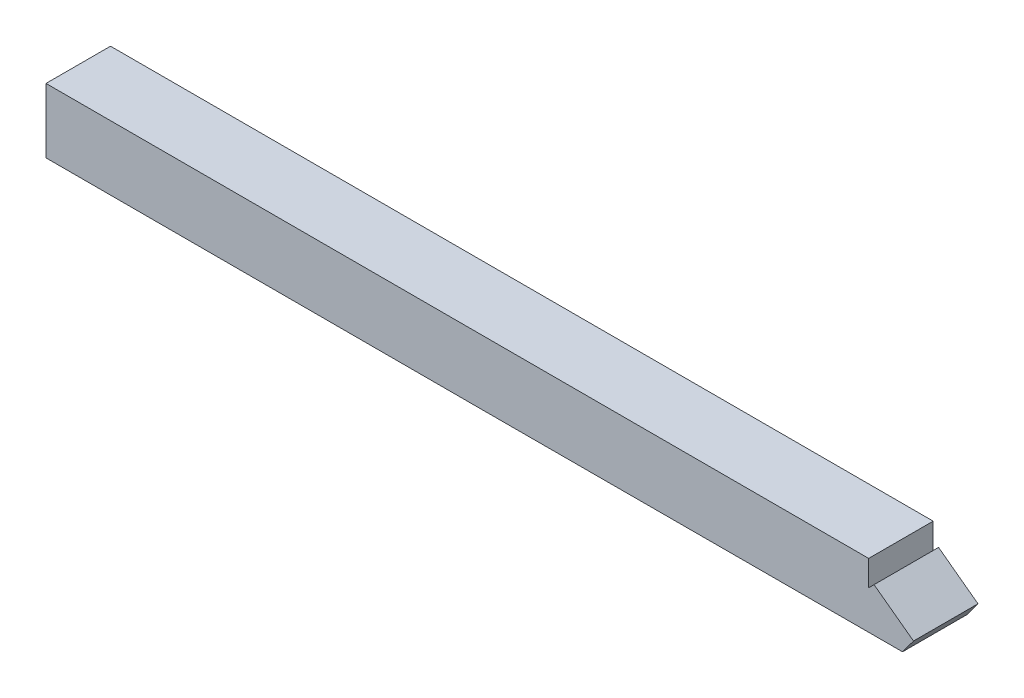
ISO-10303-21;
HEADER;
FILE_DESCRIPTION(('STEP AP214'),'2;1');
FILE_NAME('part.step','',(''),(''),'','','');
FILE_SCHEMA(('AUTOMOTIVE_DESIGN { 1 0 10303 214 1 1 1 1 }'));
ENDSEC;
DATA;
#1=APPLICATION_CONTEXT('core data for automotive mechanical design processes');
#2=APPLICATION_PROTOCOL_DEFINITION('international standard','automotive_design',2000,#1);
#3=PRODUCT_CONTEXT('',#1,'mechanical');
#4=PRODUCT('Part','Part','',(#3));
#5=PRODUCT_RELATED_PRODUCT_CATEGORY('part','',(#4));
#6=PRODUCT_DEFINITION_FORMATION('','',#4);
#7=PRODUCT_DEFINITION_CONTEXT('part definition',#1,'design');
#8=PRODUCT_DEFINITION('design','',#6,#7);
#9=PRODUCT_DEFINITION_SHAPE('','',#8);
#10=(LENGTH_UNIT() NAMED_UNIT(*) SI_UNIT(.MILLI.,.METRE.));
#11=(NAMED_UNIT(*) PLANE_ANGLE_UNIT() SI_UNIT($,.RADIAN.));
#12=(NAMED_UNIT(*) SI_UNIT($,.STERADIAN.) SOLID_ANGLE_UNIT());
#13=UNCERTAINTY_MEASURE_WITH_UNIT(LENGTH_MEASURE(1.E-05),#10,'distance_accuracy_value','');
#14=(GEOMETRIC_REPRESENTATION_CONTEXT(3) GLOBAL_UNCERTAINTY_ASSIGNED_CONTEXT((#13)) GLOBAL_UNIT_ASSIGNED_CONTEXT((#10,
#11,#12)) REPRESENTATION_CONTEXT('',''));
#15=CARTESIAN_POINT('',(0.,0.,0.));
#16=DIRECTION('',(0.,0.,1.));
#17=DIRECTION('',(1.,0.,0.));
#18=AXIS2_PLACEMENT_3D('',#15,#16,#17);
#19=CARTESIAN_POINT('',(16.2,0.0200073798584463,2.5));
#20=DIRECTION('',(-0.00123502250617323,0.999999237359414,0.));
#21=DIRECTION('',(-0.999999237359414,-0.00123502250617323,0.));
#22=AXIS2_PLACEMENT_3D('',#19,#20,#21);
#23=PLANE('',#22);
#24=DIRECTION('',(0.999999237359414,0.00123502250617323,0.));
#25=VECTOR('',#24,1.);
#26=CARTESIAN_POINT('',(16.2,0.0200073798584463,0.));
#27=LINE('',#26,#25);
#28=CARTESIAN_POINT('',(0.,0.,0.));
#29=VERTEX_POINT('',#28);
#30=CARTESIAN_POINT('',(16.2,0.0200073798584463,0.));
#31=VERTEX_POINT('',#30);
#32=EDGE_CURVE('E124',#29,#31,#27,.T.);
#33=ORIENTED_EDGE('',*,*,#32,.T.);
#34=DIRECTION('',(0.,0.,-1.));
#35=VECTOR('',#34,1.);
#36=CARTESIAN_POINT('',(16.2,0.0200073798584463,2.5));
#37=LINE('',#36,#35);
#38=CARTESIAN_POINT('',(16.2,0.0200073798584463,2.5));
#39=VERTEX_POINT('',#38);
#40=EDGE_CURVE('E11',#39,#31,#37,.T.);
#41=ORIENTED_EDGE('',*,*,#40,.F.);
#42=DIRECTION('',(0.999999237359414,0.00123502250617323,0.));
#43=VECTOR('',#42,1.);
#44=CARTESIAN_POINT('',(16.2,0.0200073798584463,2.5));
#45=LINE('',#44,#43);
#46=CARTESIAN_POINT('',(0.,0.,2.5));
#47=VERTEX_POINT('',#46);
#48=EDGE_CURVE('E51',#47,#39,#45,.T.);
#49=ORIENTED_EDGE('',*,*,#48,.F.);
#50=DIRECTION('',(0.,0.,-1.));
#51=VECTOR('',#50,1.);
#52=CARTESIAN_POINT('',(0.,0.,2.5));
#53=LINE('',#52,#51);
#54=EDGE_CURVE('E80',#47,#29,#53,.T.);
#55=ORIENTED_EDGE('',*,*,#54,.T.);
#56=EDGE_LOOP('',(#33,#41,#49,#55));
#57=FACE_BOUND('',#56,.T.);
#58=ADVANCED_FACE('F34',(#57),#23,.F.);
#59=CARTESIAN_POINT('',(16.6242935772563,0.594484954615779,2.5));
#60=DIRECTION('',(-0.804390452394621,0.594101001595163,0.));
#61=DIRECTION('',(-0.594101001595163,-0.804390452394622,0.));
#62=AXIS2_PLACEMENT_3D('',#59,#60,#61);
#63=PLANE('',#62);
#64=DIRECTION('',(0.594101001595163,0.804390452394621,0.));
#65=VECTOR('',#64,1.);
#66=CARTESIAN_POINT('',(16.6242935772563,0.594484954615779,0.));
#67=LINE('',#66,#65);
#68=CARTESIAN_POINT('',(16.6242935772563,0.594484954615779,0.));
#69=VERTEX_POINT('',#68);
#70=EDGE_CURVE('E126',#31,#69,#67,.T.);
#71=ORIENTED_EDGE('',*,*,#70,.T.);
#72=DIRECTION('',(0.,0.,-1.));
#73=VECTOR('',#72,1.);
#74=CARTESIAN_POINT('',(16.6242935772563,0.594484954615779,2.5));
#75=LINE('',#74,#73);
#76=CARTESIAN_POINT('',(16.6242935772563,0.594484954615779,2.5));
#77=VERTEX_POINT('',#76);
#78=EDGE_CURVE('E43',#77,#69,#75,.T.);
#79=ORIENTED_EDGE('',*,*,#78,.F.);
#80=DIRECTION('',(0.594101001595163,0.804390452394621,0.));
#81=VECTOR('',#80,1.);
#82=CARTESIAN_POINT('',(16.6242935772563,0.594484954615779,2.5));
#83=LINE('',#82,#81);
#84=EDGE_CURVE('E88',#39,#77,#83,.T.);
#85=ORIENTED_EDGE('',*,*,#84,.F.);
#86=ORIENTED_EDGE('',*,*,#40,.T.);
#87=EDGE_LOOP('',(#71,#79,#85,#86));
#88=FACE_BOUND('',#87,.T.);
#89=ADVANCED_FACE('F184',(#88),#63,.F.);
#90=CARTESIAN_POINT('',(15.0959830313986,1.72325373020171,2.5));
#91=DIRECTION('',(-0.594101001595164,-0.804390452394621,0.));
#92=DIRECTION('',(0.804390452394621,-0.594101001595164,0.));
#93=AXIS2_PLACEMENT_3D('',#90,#91,#92);
#94=PLANE('',#93);
#95=DIRECTION('',(-0.804390452394621,0.594101001595164,0.));
#96=VECTOR('',#95,1.);
#97=CARTESIAN_POINT('',(15.0959830313986,1.72325373020171,0.));
#98=LINE('',#97,#96);
#99=CARTESIAN_POINT('',(15.0959830313986,1.72325373020171,0.));
#100=VERTEX_POINT('',#99);
#101=EDGE_CURVE('E129',#69,#100,#98,.T.);
#102=ORIENTED_EDGE('',*,*,#101,.T.);
#103=DIRECTION('',(0.,0.,-1.));
#104=VECTOR('',#103,1.);
#105=CARTESIAN_POINT('',(15.0959830313986,1.72325373020171,2.5));
#106=LINE('',#105,#104);
#107=CARTESIAN_POINT('',(15.0959830313986,1.72325373020171,2.5));
#108=VERTEX_POINT('',#107);
#109=EDGE_CURVE('E114',#108,#100,#106,.T.);
#110=ORIENTED_EDGE('',*,*,#109,.F.);
#111=DIRECTION('',(-0.804390452394621,0.594101001595164,0.));
#112=VECTOR('',#111,1.);
#113=CARTESIAN_POINT('',(15.0959830313986,1.72325373020171,2.5));
#114=LINE('',#113,#112);
#115=EDGE_CURVE('E105',#77,#108,#114,.T.);
#116=ORIENTED_EDGE('',*,*,#115,.F.);
#117=ORIENTED_EDGE('',*,*,#78,.T.);
#118=EDGE_LOOP('',(#102,#110,#116,#117));
#119=FACE_BOUND('',#118,.T.);
#120=ADVANCED_FACE('F141',(#119),#94,.F.);
#121=CARTESIAN_POINT('',(14.8868454936691,1.51411619247225,2.5));
#122=DIRECTION('',(0.707106781186548,-0.707106781186548,0.));
#123=DIRECTION('',(0.707106781186548,0.707106781186548,0.));
#124=AXIS2_PLACEMENT_3D('',#121,#122,#123);
#125=PLANE('',#124);
#126=DIRECTION('',(-0.707106781186547,-0.707106781186547,0.));
#127=VECTOR('',#126,1.);
#128=CARTESIAN_POINT('',(14.8868454936691,1.51411619247225,0.));
#129=LINE('',#128,#127);
#130=CARTESIAN_POINT('',(14.8868454936691,1.51411619247225,0.));
#131=VERTEX_POINT('',#130);
#132=EDGE_CURVE('E113',#100,#131,#129,.T.);
#133=ORIENTED_EDGE('',*,*,#132,.T.);
#134=DIRECTION('',(0.,0.,-1.));
#135=VECTOR('',#134,1.);
#136=CARTESIAN_POINT('',(14.8868454936691,1.51411619247225,2.5));
#137=LINE('',#136,#135);
#138=CARTESIAN_POINT('',(14.8868454936691,1.51411619247225,2.5));
#139=VERTEX_POINT('',#138);
#140=EDGE_CURVE('E110',#139,#131,#137,.T.);
#141=ORIENTED_EDGE('',*,*,#140,.F.);
#142=DIRECTION('',(-0.707106781186547,-0.707106781186547,0.));
#143=VECTOR('',#142,1.);
#144=CARTESIAN_POINT('',(14.8868454936691,1.51411619247225,2.5));
#145=LINE('',#144,#143);
#146=EDGE_CURVE('E98',#108,#139,#145,.T.);
#147=ORIENTED_EDGE('',*,*,#146,.F.);
#148=ORIENTED_EDGE('',*,*,#109,.T.);
#149=EDGE_LOOP('',(#133,#141,#147,#148));
#150=FACE_BOUND('',#149,.T.);
#151=ADVANCED_FACE('F111',(#150),#125,.F.);
#152=CARTESIAN_POINT('',(14.8868454936691,1.51411619247225,2.5));
#153=DIRECTION('',(-1.,0.,0.));
#154=DIRECTION('',(0.,-1.,0.));
#155=AXIS2_PLACEMENT_3D('',#152,#153,#154);
#156=PLANE('',#155);
#157=DIRECTION('',(0.,1.,0.));
#158=VECTOR('',#157,1.);
#159=CARTESIAN_POINT('',(14.8868454936691,1.51411619247225,0.));
#160=LINE('',#159,#158);
#161=CARTESIAN_POINT('',(14.8868454936691,2.5,0.));
#162=VERTEX_POINT('',#161);
#163=EDGE_CURVE('E76',#131,#162,#160,.T.);
#164=ORIENTED_EDGE('',*,*,#163,.T.);
#165=DIRECTION('',(0.,0.,-1.));
#166=VECTOR('',#165,1.);
#167=CARTESIAN_POINT('',(14.8868454936691,2.5,2.5));
#168=LINE('',#167,#166);
#169=CARTESIAN_POINT('',(14.8868454936691,2.5,2.5));
#170=VERTEX_POINT('',#169);
#171=EDGE_CURVE('E115',#170,#162,#168,.T.);
#172=ORIENTED_EDGE('',*,*,#171,.F.);
#173=DIRECTION('',(0.,1.,0.));
#174=VECTOR('',#173,1.);
#175=CARTESIAN_POINT('',(14.8868454936691,1.51411619247225,2.5));
#176=LINE('',#175,#174);
#177=EDGE_CURVE('E103',#139,#170,#176,.T.);
#178=ORIENTED_EDGE('',*,*,#177,.F.);
#179=ORIENTED_EDGE('',*,*,#140,.T.);
#180=EDGE_LOOP('',(#164,#172,#178,#179));
#181=FACE_BOUND('',#180,.T.);
#182=ADVANCED_FACE('F117',(#181),#156,.F.);
#183=CARTESIAN_POINT('',(14.8868454936691,2.5,2.5));
#184=DIRECTION('',(0.,-1.,0.));
#185=DIRECTION('',(1.,0.,0.));
#186=AXIS2_PLACEMENT_3D('',#183,#184,#185);
#187=PLANE('',#186);
#188=DIRECTION('',(-1.,0.,0.));
#189=VECTOR('',#188,1.);
#190=CARTESIAN_POINT('',(14.8868454936691,2.5,0.));
#191=LINE('',#190,#189);
#192=CARTESIAN_POINT('',(-17.,2.5,0.));
#193=VERTEX_POINT('',#192);
#194=EDGE_CURVE('E133',#162,#193,#191,.T.);
#195=ORIENTED_EDGE('',*,*,#194,.T.);
#196=DIRECTION('',(0.,0.,-1.));
#197=VECTOR('',#196,1.);
#198=CARTESIAN_POINT('',(-17.,2.5,2.5));
#199=LINE('',#198,#197);
#200=CARTESIAN_POINT('',(-17.,2.5,2.5));
#201=VERTEX_POINT('',#200);
#202=EDGE_CURVE('E154',#201,#193,#199,.T.);
#203=ORIENTED_EDGE('',*,*,#202,.F.);
#204=DIRECTION('',(-1.,0.,0.));
#205=VECTOR('',#204,1.);
#206=CARTESIAN_POINT('',(14.8868454936691,2.5,2.5));
#207=LINE('',#206,#205);
#208=EDGE_CURVE('E119',#170,#201,#207,.T.);
#209=ORIENTED_EDGE('',*,*,#208,.F.);
#210=ORIENTED_EDGE('',*,*,#171,.T.);
#211=EDGE_LOOP('',(#195,#203,#209,#210));
#212=FACE_BOUND('',#211,.T.);
#213=ADVANCED_FACE('F153',(#212),#187,.F.);
#214=CARTESIAN_POINT('',(0.,0.,2.5));
#215=DIRECTION('',(0.,0.,-1.));
#216=DIRECTION('',(-1.,0.,0.));
#217=AXIS2_PLACEMENT_3D('',#214,#215,#216);
#218=PLANE('',#217);
#219=ORIENTED_EDGE('',*,*,#48,.T.);
#220=ORIENTED_EDGE('',*,*,#84,.T.);
#221=ORIENTED_EDGE('',*,*,#115,.T.);
#222=ORIENTED_EDGE('',*,*,#146,.T.);
#223=ORIENTED_EDGE('',*,*,#177,.T.);
#224=ORIENTED_EDGE('',*,*,#208,.T.);
#225=DIRECTION('',(0.,1.,0.));
#226=VECTOR('',#225,1.);
#227=CARTESIAN_POINT('',(-17.,0.,2.5));
#228=LINE('',#227,#226);
#229=CARTESIAN_POINT('',(-17.,0.,2.5));
#230=VERTEX_POINT('',#229);
#231=EDGE_CURVE('E167',#230,#201,#228,.T.);
#232=ORIENTED_EDGE('',*,*,#231,.F.);
#233=DIRECTION('',(1.,0.,0.));
#234=VECTOR('',#233,1.);
#235=CARTESIAN_POINT('',(-17.,0.,2.5));
#236=LINE('',#235,#234);
#237=EDGE_CURVE('E169',#230,#47,#236,.T.);
#238=ORIENTED_EDGE('',*,*,#237,.T.);
#239=EDGE_LOOP('',(#219,#220,#221,#222,#223,#224,#232,#238));
#240=FACE_BOUND('',#239,.T.);
#241=ADVANCED_FACE('F100',(#240),#218,.F.);
#242=CARTESIAN_POINT('',(0.,0.,0.));
#243=DIRECTION('',(0.,0.,-1.));
#244=DIRECTION('',(-1.,0.,0.));
#245=AXIS2_PLACEMENT_3D('',#242,#243,#244);
#246=PLANE('',#245);
#247=ORIENTED_EDGE('',*,*,#32,.F.);
#248=DIRECTION('',(1.,0.,0.));
#249=VECTOR('',#248,1.);
#250=CARTESIAN_POINT('',(-17.,0.,0.));
#251=LINE('',#250,#249);
#252=CARTESIAN_POINT('',(-17.,0.,0.));
#253=VERTEX_POINT('',#252);
#254=EDGE_CURVE('E171',#253,#29,#251,.T.);
#255=ORIENTED_EDGE('',*,*,#254,.F.);
#256=DIRECTION('',(0.,-1.,0.));
#257=VECTOR('',#256,1.);
#258=CARTESIAN_POINT('',(-17.,2.5,0.));
#259=LINE('',#258,#257);
#260=EDGE_CURVE('E149',#193,#253,#259,.T.);
#261=ORIENTED_EDGE('',*,*,#260,.F.);
#262=ORIENTED_EDGE('',*,*,#194,.F.);
#263=ORIENTED_EDGE('',*,*,#163,.F.);
#264=ORIENTED_EDGE('',*,*,#132,.F.);
#265=ORIENTED_EDGE('',*,*,#101,.F.);
#266=ORIENTED_EDGE('',*,*,#70,.F.);
#267=EDGE_LOOP('',(#247,#255,#261,#262,#263,#264,#265,#266));
#268=FACE_BOUND('',#267,.T.);
#269=ADVANCED_FACE('F143',(#268),#246,.T.);
#270=CARTESIAN_POINT('',(-17.,0.,0.));
#271=DIRECTION('',(0.,1.,0.));
#272=DIRECTION('',(-1.,0.,0.));
#273=AXIS2_PLACEMENT_3D('',#270,#271,#272);
#274=PLANE('',#273);
#275=ORIENTED_EDGE('',*,*,#54,.F.);
#276=ORIENTED_EDGE('',*,*,#237,.F.);
#277=DIRECTION('',(0.,0.,1.));
#278=VECTOR('',#277,1.);
#279=CARTESIAN_POINT('',(-17.,0.,0.));
#280=LINE('',#279,#278);
#281=EDGE_CURVE('E163',#253,#230,#280,.T.);
#282=ORIENTED_EDGE('',*,*,#281,.F.);
#283=ORIENTED_EDGE('',*,*,#254,.T.);
#284=EDGE_LOOP('',(#275,#276,#282,#283));
#285=FACE_BOUND('',#284,.T.);
#286=ADVANCED_FACE('F200',(#285),#274,.F.);
#287=CARTESIAN_POINT('',(-17.,0.,0.));
#288=DIRECTION('',(-1.,0.,0.));
#289=DIRECTION('',(0.,-1.,0.));
#290=AXIS2_PLACEMENT_3D('',#287,#288,#289);
#291=PLANE('',#290);
#292=CARTESIAN_POINT('',(-17.,1.25,1.25));
#293=DIRECTION('',(-1.,0.,0.));
#294=DIRECTION('',(0.,-1.,0.));
#295=AXIS2_PLACEMENT_3D('',#292,#293,#294);
#296=CIRCLE('',#295,1.);
#297=CARTESIAN_POINT('',(-17.,0.250000000000003,1.25));
#298=VERTEX_POINT('',#297);
#299=EDGE_CURVE('E234',#298,#298,#296,.T.);
#300=ORIENTED_EDGE('',*,*,#299,.F.);
#301=EDGE_LOOP('',(#300));
#302=FACE_BOUND('',#301,.T.);
#303=ORIENTED_EDGE('',*,*,#202,.T.);
#304=ORIENTED_EDGE('',*,*,#260,.T.);
#305=ORIENTED_EDGE('',*,*,#281,.T.);
#306=ORIENTED_EDGE('',*,*,#231,.T.);
#307=EDGE_LOOP('',(#303,#304,#305,#306));
#308=FACE_BOUND('',#307,.T.);
#309=ADVANCED_FACE('F168',(#302,#308),#291,.T.);
#310=CARTESIAN_POINT('',(-7.5,1.25,1.25));
#311=DIRECTION('',(-1.,0.,0.));
#312=DIRECTION('',(0.,-1.,0.));
#313=AXIS2_PLACEMENT_3D('',#310,#311,#312);
#314=CYLINDRICAL_SURFACE('',#313,1.);
#315=CARTESIAN_POINT('',(-7.5,1.25,1.25));
#316=DIRECTION('',(-1.,0.,0.));
#317=DIRECTION('',(0.,-1.,0.));
#318=AXIS2_PLACEMENT_3D('',#315,#316,#317);
#319=CIRCLE('',#318,1.);
#320=CARTESIAN_POINT('',(-7.5,0.250000000000001,1.25));
#321=VERTEX_POINT('',#320);
#322=EDGE_CURVE('E233',#321,#321,#319,.T.);
#323=ORIENTED_EDGE('',*,*,#322,.F.);
#324=EDGE_LOOP('',(#323));
#325=FACE_BOUND('',#324,.T.);
#326=ORIENTED_EDGE('',*,*,#299,.T.);
#327=EDGE_LOOP('',(#326));
#328=FACE_BOUND('',#327,.T.);
#329=ADVANCED_FACE('F221',(#325,#328),#314,.F.);
#330=CARTESIAN_POINT('',(-7.5,1.25,1.25));
#331=DIRECTION('',(-1.,0.,0.));
#332=DIRECTION('',(0.,-1.,0.));
#333=AXIS2_PLACEMENT_3D('',#330,#331,#332);
#334=PLANE('',#333);
#335=ORIENTED_EDGE('',*,*,#322,.T.);
#336=EDGE_LOOP('',(#335));
#337=FACE_BOUND('',#336,.T.);
#338=ADVANCED_FACE('F225',(#337),#334,.T.);
#339=CLOSED_SHELL('',(#58,#89,#120,#151,#182,#213,#241,#269,#286,#309,#329,#338));
#340=CARTESIAN_POINT('',(9.5,1.25,1.25));
#341=DIRECTION('',(-1.,0.,0.));
#342=DIRECTION('',(0.,-1.,0.));
#343=AXIS2_PLACEMENT_3D('',#340,#341,#342);
#344=PLANE('',#343);
#345=CARTESIAN_POINT('',(9.5,1.25,1.25));
#346=DIRECTION('',(-1.,0.,0.));
#347=DIRECTION('',(0.,-1.,0.));
#348=AXIS2_PLACEMENT_3D('',#345,#346,#347);
#349=CIRCLE('',#348,1.);
#350=CARTESIAN_POINT('',(9.5,0.249999999999999,1.25));
#351=VERTEX_POINT('',#350);
#352=EDGE_CURVE('E127',#351,#351,#349,.T.);
#353=ORIENTED_EDGE('',*,*,#352,.T.);
#354=EDGE_LOOP('',(#353));
#355=FACE_BOUND('',#354,.T.);
#356=ADVANCED_FACE('F207',(#355),#344,.T.);
#357=CARTESIAN_POINT('',(9.5,1.25,1.25));
#358=DIRECTION('',(-1.,0.,0.));
#359=DIRECTION('',(0.,-1.,0.));
#360=AXIS2_PLACEMENT_3D('',#357,#358,#359);
#361=CYLINDRICAL_SURFACE('',#360,1.);
#362=ORIENTED_EDGE('',*,*,#352,.F.);
#363=EDGE_LOOP('',(#362));
#364=FACE_BOUND('',#363,.T.);
#365=CARTESIAN_POINT('',(0.,1.25,1.25));
#366=DIRECTION('',(-1.,0.,0.));
#367=DIRECTION('',(0.,-1.,0.));
#368=AXIS2_PLACEMENT_3D('',#365,#366,#367);
#369=CIRCLE('',#368,1.);
#370=CARTESIAN_POINT('',(0.,0.25,1.25));
#371=VERTEX_POINT('',#370);
#372=EDGE_CURVE('E178',#371,#371,#369,.T.);
#373=ORIENTED_EDGE('',*,*,#372,.T.);
#374=EDGE_LOOP('',(#373));
#375=FACE_BOUND('',#374,.T.);
#376=ADVANCED_FACE('F203',(#364,#375),#361,.F.);
#377=CARTESIAN_POINT('',(0.,0.,0.));
#378=DIRECTION('',(-1.,0.,0.));
#379=DIRECTION('',(0.,-1.,0.));
#380=AXIS2_PLACEMENT_3D('',#377,#378,#379);
#381=PLANE('',#380);
#382=ORIENTED_EDGE('',*,*,#372,.F.);
#383=EDGE_LOOP('',(#382));
#384=FACE_BOUND('',#383,.T.);
#385=ADVANCED_FACE('F206',(#384),#381,.F.);
#386=CLOSED_SHELL('',(#356,#376,#385));
#387=ORIENTED_CLOSED_SHELL('',*,#386,.T.);
#388=BREP_WITH_VOIDS('B2',#339,(#387));
#389=ADVANCED_BREP_SHAPE_REPRESENTATION('',(#18,#388),#14);
#390=SHAPE_DEFINITION_REPRESENTATION(#9,#389);
ENDSEC;
END-ISO-10303-21;
